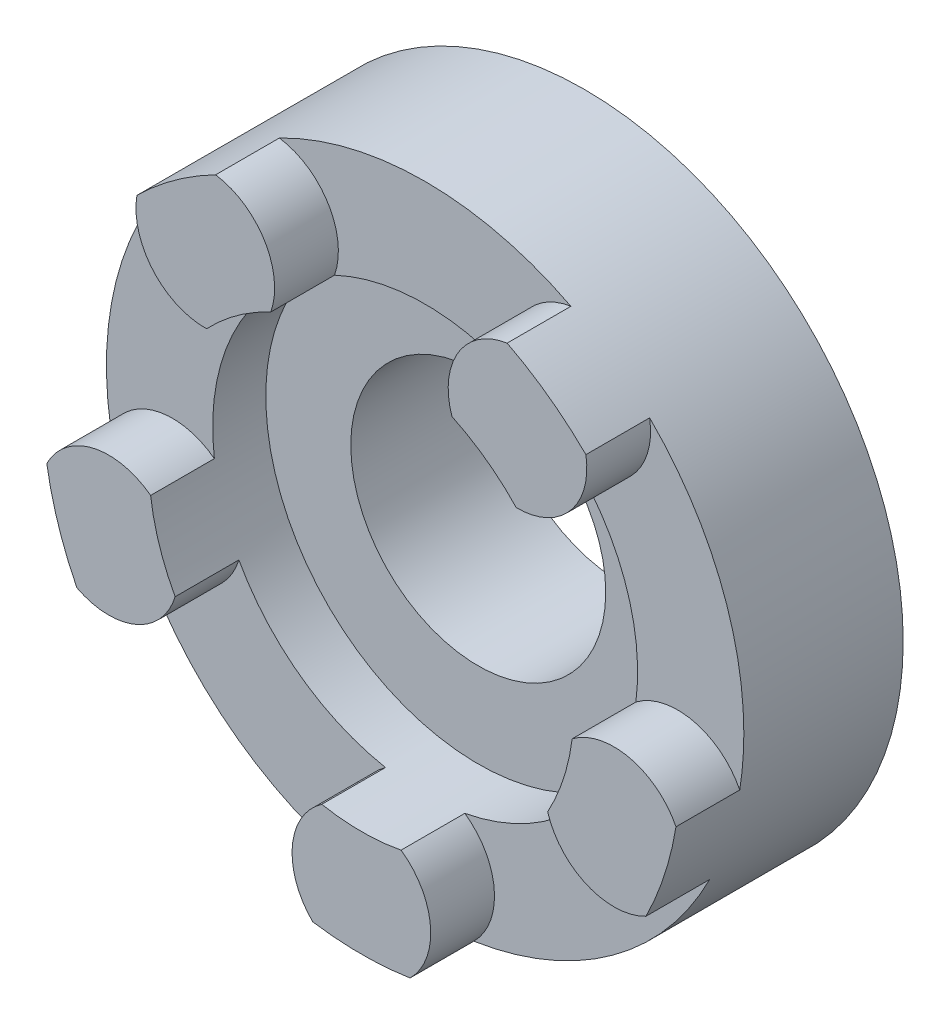
ISO-10303-21;
HEADER;
FILE_DESCRIPTION(('STEP AP214'),'2;1');
FILE_NAME('part.step','',(''),(''),'','','');
FILE_SCHEMA(('AUTOMOTIVE_DESIGN { 1 0 10303 214 1 1 1 1 }'));
ENDSEC;
DATA;
#1=APPLICATION_CONTEXT('core data for automotive mechanical design processes');
#2=APPLICATION_PROTOCOL_DEFINITION('international standard','automotive_design',2000,#1);
#3=PRODUCT_CONTEXT('',#1,'mechanical');
#4=PRODUCT('Part','Part','',(#3));
#5=PRODUCT_RELATED_PRODUCT_CATEGORY('part','',(#4));
#6=PRODUCT_DEFINITION_FORMATION('','',#4);
#7=PRODUCT_DEFINITION_CONTEXT('part definition',#1,'design');
#8=PRODUCT_DEFINITION('design','',#6,#7);
#9=PRODUCT_DEFINITION_SHAPE('','',#8);
#10=(LENGTH_UNIT() NAMED_UNIT(*) SI_UNIT(.MILLI.,.METRE.));
#11=(NAMED_UNIT(*) PLANE_ANGLE_UNIT() SI_UNIT($,.RADIAN.));
#12=(NAMED_UNIT(*) SI_UNIT($,.STERADIAN.) SOLID_ANGLE_UNIT());
#13=UNCERTAINTY_MEASURE_WITH_UNIT(LENGTH_MEASURE(1.E-05),#10,'distance_accuracy_value','');
#14=(GEOMETRIC_REPRESENTATION_CONTEXT(3) GLOBAL_UNCERTAINTY_ASSIGNED_CONTEXT((#13)) GLOBAL_UNIT_ASSIGNED_CONTEXT((#10,
#11,#12)) REPRESENTATION_CONTEXT('',''));
#15=CARTESIAN_POINT('',(0.,0.,0.));
#16=DIRECTION('',(0.,0.,1.));
#17=DIRECTION('',(1.,0.,0.));
#18=AXIS2_PLACEMENT_3D('',#15,#16,#17);
#19=CARTESIAN_POINT('',(0.,0.,-5.));
#20=DIRECTION('',(0.,0.,1.));
#21=DIRECTION('',(1.,0.,0.));
#22=AXIS2_PLACEMENT_3D('',#19,#20,#21);
#23=PLANE('',#22);
#24=CARTESIAN_POINT('',(0.,0.,-5.));
#25=DIRECTION('',(0.,0.,1.));
#26=DIRECTION('',(1.,0.,0.));
#27=AXIS2_PLACEMENT_3D('',#24,#25,#26);
#28=CIRCLE('',#27,15.);
#29=CARTESIAN_POINT('',(15.,0.,-5.));
#30=VERTEX_POINT('',#29);
#31=EDGE_CURVE('E50',#30,#30,#28,.T.);
#32=ORIENTED_EDGE('',*,*,#31,.F.);
#33=EDGE_LOOP('',(#32));
#34=FACE_BOUND('',#33,.T.);
#35=CARTESIAN_POINT('',(0.,0.,-5.));
#36=DIRECTION('',(0.,0.,1.));
#37=DIRECTION('',(1.,0.,0.));
#38=AXIS2_PLACEMENT_3D('',#35,#36,#37);
#39=CIRCLE('',#38,7.);
#40=CARTESIAN_POINT('',(7.,0.,-5.));
#41=VERTEX_POINT('',#40);
#42=EDGE_CURVE('E11',#41,#41,#39,.F.);
#43=ORIENTED_EDGE('',*,*,#42,.F.);
#44=EDGE_LOOP('',(#43));
#45=FACE_BOUND('',#44,.T.);
#46=ADVANCED_FACE('F41',(#34,#45),#23,.F.);
#47=CARTESIAN_POINT('',(0.,0.,2.5));
#48=DIRECTION('',(0.,0.,1.));
#49=DIRECTION('',(1.,0.,0.));
#50=AXIS2_PLACEMENT_3D('',#47,#48,#49);
#51=PLANE('',#50);
#52=CARTESIAN_POINT('',(0.,0.,2.5));
#53=DIRECTION('',(0.,0.,1.));
#54=DIRECTION('',(1.,0.,0.));
#55=AXIS2_PLACEMENT_3D('',#52,#53,#54);
#56=CIRCLE('',#55,15.);
#57=CARTESIAN_POINT('',(2.29060358245761,-14.8240728286133,2.5));
#58=VERTEX_POINT('',#57);
#59=CARTESIAN_POINT('',(13.3906956273311,-6.7593838932388,2.5));
#60=VERTEX_POINT('',#59);
#61=EDGE_CURVE('E372',#58,#60,#56,.T.);
#62=ORIENTED_EDGE('',*,*,#61,.T.);
#63=CARTESIAN_POINT('',(11.8882064536894,-3.86271242968698,2.5));
#64=DIRECTION('',(0.,0.,1.));
#65=DIRECTION('',(1.,0.,0.));
#66=AXIS2_PLACEMENT_3D('',#63,#64,#65);
#67=CIRCLE('',#66,3.26315480550128);
#68=CARTESIAN_POINT('',(8.76615619788801,-4.81191287475464,2.5));
#69=VERTEX_POINT('',#68);
#70=EDGE_CURVE('E195',#69,#60,#67,.T.);
#71=ORIENTED_EDGE('',*,*,#70,.F.);
#72=CARTESIAN_POINT('',(0.,0.,2.5));
#73=DIRECTION('',(0.,0.,1.));
#74=DIRECTION('',(1.,0.,0.));
#75=AXIS2_PLACEMENT_3D('',#72,#73,#74);
#76=CIRCLE('',#75,10.);
#77=CARTESIAN_POINT('',(1.86750985488725,-9.82407282861336,2.5));
#78=VERTEX_POINT('',#77);
#79=EDGE_CURVE('E362',#78,#69,#76,.T.);
#80=ORIENTED_EDGE('',*,*,#79,.F.);
#81=CARTESIAN_POINT('',(0.,-12.5,2.5));
#82=DIRECTION('',(0.,0.,1.));
#83=DIRECTION('',(1.,0.,0.));
#84=AXIS2_PLACEMENT_3D('',#81,#82,#83);
#85=CIRCLE('',#84,3.26315480550132);
#86=EDGE_CURVE('E330',#58,#78,#85,.T.);
#87=ORIENTED_EDGE('',*,*,#86,.F.);
#88=EDGE_LOOP('',(#62,#71,#80,#87));
#89=FACE_BOUND('',#88,.T.);
#90=ADVANCED_FACE('F407',(#89),#51,.T.);
#91=CARTESIAN_POINT('',(9.92034076253372,-1.25969804128286,2.5));
#92=VERTEX_POINT('',#91);
#93=CARTESIAN_POINT('',(7.28529233587261,6.85014712111175,2.5));
#94=VERTEX_POINT('',#93);
#95=EDGE_CURVE('E367',#92,#94,#76,.T.);
#96=ORIENTED_EDGE('',*,*,#95,.F.);
#97=CARTESIAN_POINT('',(11.8882064536894,-3.86271242968698,2.5));
#98=DIRECTION('',(0.,0.,1.));
#99=DIRECTION('',(1.,0.,0.));
#100=AXIS2_PLACEMENT_3D('',#97,#98,#99);
#101=CIRCLE('',#100,3.26315480550132);
#102=CARTESIAN_POINT('',(14.8063664960422,-2.40239696654825,2.5));
#103=VERTEX_POINT('',#102);
#104=EDGE_CURVE('E189',#103,#92,#101,.T.);
#105=ORIENTED_EDGE('',*,*,#104,.F.);
#106=CARTESIAN_POINT('',(10.5665086131529,10.6465438395832,2.5));
#107=VERTEX_POINT('',#106);
#108=EDGE_CURVE('E376',#103,#107,#56,.T.);
#109=ORIENTED_EDGE('',*,*,#108,.T.);
#110=CARTESIAN_POINT('',(7.347315653656,10.1127124296868,2.5));
#111=DIRECTION('',(0.,0.,1.));
#112=DIRECTION('',(1.,0.,0.));
#113=AXIS2_PLACEMENT_3D('',#110,#111,#112);
#114=CIRCLE('',#113,3.26315480550129);
#115=EDGE_CURVE('E200',#94,#107,#114,.T.);
#116=ORIENTED_EDGE('',*,*,#115,.F.);
#117=EDGE_LOOP('',(#96,#105,#109,#116));
#118=FACE_BOUND('',#117,.T.);
#119=ADVANCED_FACE('F415',(#118),#51,.T.);
#120=CARTESIAN_POINT('',(4.26359791633974,9.0455366235389,2.5));
#121=VERTEX_POINT('',#120);
#122=CARTESIAN_POINT('',(-4.26359791633966,9.04553662353894,2.5));
#123=VERTEX_POINT('',#122);
#124=EDGE_CURVE('E524',#121,#123,#76,.T.);
#125=ORIENTED_EDGE('',*,*,#124,.F.);
#126=CARTESIAN_POINT('',(7.347315653656,10.1127124296868,2.5));
#127=DIRECTION('',(0.,0.,1.));
#128=DIRECTION('',(1.,0.,0.));
#129=AXIS2_PLACEMENT_3D('',#126,#127,#128);
#130=CIRCLE('',#129,3.26315480550131);
#131=CARTESIAN_POINT('',(6.86023416198428,13.3393098488169,2.5));
#132=VERTEX_POINT('',#131);
#133=EDGE_CURVE('E230',#132,#121,#130,.T.);
#134=ORIENTED_EDGE('',*,*,#133,.F.);
#135=CARTESIAN_POINT('',(-6.86023416198416,13.339309848817,2.5));
#136=VERTEX_POINT('',#135);
#137=EDGE_CURVE('E502',#132,#136,#56,.T.);
#138=ORIENTED_EDGE('',*,*,#137,.T.);
#139=CARTESIAN_POINT('',(-7.34731565365586,10.1127124296869,2.5));
#140=DIRECTION('',(0.,0.,1.));
#141=DIRECTION('',(1.,0.,0.));
#142=AXIS2_PLACEMENT_3D('',#139,#140,#141);
#143=CIRCLE('',#142,3.26315480550129);
#144=EDGE_CURVE('E257',#123,#136,#143,.T.);
#145=ORIENTED_EDGE('',*,*,#144,.F.);
#146=EDGE_LOOP('',(#125,#134,#138,#145));
#147=FACE_BOUND('',#146,.T.);
#148=ADVANCED_FACE('F547',(#147),#51,.T.);
#149=CARTESIAN_POINT('',(-7.28529233587255,6.85014712111183,2.5));
#150=VERTEX_POINT('',#149);
#151=CARTESIAN_POINT('',(-9.92034076253373,-1.25969804128281,2.5));
#152=VERTEX_POINT('',#151);
#153=EDGE_CURVE('E526',#150,#152,#76,.T.);
#154=ORIENTED_EDGE('',*,*,#153,.F.);
#155=CARTESIAN_POINT('',(-7.34731565365586,10.1127124296869,2.5));
#156=DIRECTION('',(0.,0.,1.));
#157=DIRECTION('',(1.,0.,0.));
#158=AXIS2_PLACEMENT_3D('',#155,#156,#157);
#159=CIRCLE('',#158,3.26315480550131);
#160=CARTESIAN_POINT('',(-10.5665086131528,10.6465438395833,2.5));
#161=VERTEX_POINT('',#160);
#162=EDGE_CURVE('E262',#161,#150,#159,.T.);
#163=ORIENTED_EDGE('',*,*,#162,.F.);
#164=CARTESIAN_POINT('',(-14.8063664960422,-2.40239696654818,2.5));
#165=VERTEX_POINT('',#164);
#166=EDGE_CURVE('E500',#161,#165,#56,.T.);
#167=ORIENTED_EDGE('',*,*,#166,.T.);
#168=CARTESIAN_POINT('',(-11.8882064536894,-3.86271242968685,2.5));
#169=DIRECTION('',(0.,0.,1.));
#170=DIRECTION('',(1.,0.,0.));
#171=AXIS2_PLACEMENT_3D('',#168,#169,#170);
#172=CIRCLE('',#171,3.26315480550128);
#173=EDGE_CURVE('E291',#152,#165,#172,.T.);
#174=ORIENTED_EDGE('',*,*,#173,.F.);
#175=EDGE_LOOP('',(#154,#163,#167,#174));
#176=FACE_BOUND('',#175,.T.);
#177=ADVANCED_FACE('F539',(#176),#51,.T.);
#178=CARTESIAN_POINT('',(-8.76615619788804,-4.81191287475461,2.5));
#179=VERTEX_POINT('',#178);
#180=CARTESIAN_POINT('',(-1.86750985488717,-9.82407282861336,2.5));
#181=VERTEX_POINT('',#180);
#182=EDGE_CURVE('E368',#179,#181,#76,.T.);
#183=ORIENTED_EDGE('',*,*,#182,.F.);
#184=CARTESIAN_POINT('',(-11.8882064536894,-3.86271242968685,2.5));
#185=DIRECTION('',(0.,0.,1.));
#186=DIRECTION('',(1.,0.,0.));
#187=AXIS2_PLACEMENT_3D('',#184,#185,#186);
#188=CIRCLE('',#187,3.26315480550132);
#189=CARTESIAN_POINT('',(-13.3906956273311,-6.75938389323874,2.5));
#190=VERTEX_POINT('',#189);
#191=EDGE_CURVE('E296',#190,#179,#188,.T.);
#192=ORIENTED_EDGE('',*,*,#191,.F.);
#193=CARTESIAN_POINT('',(-2.29060358245752,-14.8240728286134,2.5));
#194=VERTEX_POINT('',#193);
#195=EDGE_CURVE('E366',#190,#194,#56,.T.);
#196=ORIENTED_EDGE('',*,*,#195,.T.);
#197=CARTESIAN_POINT('',(0.,-12.5,2.5));
#198=DIRECTION('',(0.,0.,1.));
#199=DIRECTION('',(1.,0.,0.));
#200=AXIS2_PLACEMENT_3D('',#197,#198,#199);
#201=CIRCLE('',#200,3.26315480550128);
#202=EDGE_CURVE('E325',#181,#194,#201,.T.);
#203=ORIENTED_EDGE('',*,*,#202,.F.);
#204=EDGE_LOOP('',(#183,#192,#196,#203));
#205=FACE_BOUND('',#204,.T.);
#206=ADVANCED_FACE('F389',(#205),#51,.T.);
#207=CARTESIAN_POINT('',(0.,0.,0.));
#208=DIRECTION('',(0.,0.,1.));
#209=DIRECTION('',(1.,0.,0.));
#210=AXIS2_PLACEMENT_3D('',#207,#208,#209);
#211=PLANE('',#210);
#212=CARTESIAN_POINT('',(0.,0.,0.));
#213=DIRECTION('',(0.,0.,1.));
#214=DIRECTION('',(1.,0.,0.));
#215=AXIS2_PLACEMENT_3D('',#212,#213,#214);
#216=CIRCLE('',#215,6.);
#217=CARTESIAN_POINT('',(6.,0.,0.));
#218=VERTEX_POINT('',#217);
#219=EDGE_CURVE('E375',#218,#218,#216,.T.);
#220=ORIENTED_EDGE('',*,*,#219,.F.);
#221=EDGE_LOOP('',(#220));
#222=FACE_BOUND('',#221,.T.);
#223=CARTESIAN_POINT('',(0.,0.,0.));
#224=DIRECTION('',(0.,0.,1.));
#225=DIRECTION('',(1.,0.,0.));
#226=AXIS2_PLACEMENT_3D('',#223,#224,#225);
#227=CIRCLE('',#226,10.);
#228=CARTESIAN_POINT('',(10.,0.,0.));
#229=VERTEX_POINT('',#228);
#230=EDGE_CURVE('E361',#229,#229,#227,.T.);
#231=ORIENTED_EDGE('',*,*,#230,.T.);
#232=EDGE_LOOP('',(#231));
#233=FACE_BOUND('',#232,.T.);
#234=ADVANCED_FACE('F386',(#222,#233),#211,.T.);
#235=CARTESIAN_POINT('',(0.,0.,-5.));
#236=DIRECTION('',(0.,0.,1.));
#237=DIRECTION('',(1.,0.,0.));
#238=AXIS2_PLACEMENT_3D('',#235,#236,#237);
#239=CYLINDRICAL_SURFACE('',#238,15.);
#240=ORIENTED_EDGE('',*,*,#31,.T.);
#241=EDGE_LOOP('',(#240));
#242=FACE_BOUND('',#241,.T.);
#243=ORIENTED_EDGE('',*,*,#61,.F.);
#244=DIRECTION('',(0.,0.,-1.));
#245=VECTOR('',#244,1.);
#246=CARTESIAN_POINT('',(2.29060358245762,-14.8240728286133,5.5));
#247=LINE('',#246,#245);
#248=CARTESIAN_POINT('',(2.29060358245762,-14.8240728286133,5.5));
#249=VERTEX_POINT('',#248);
#250=EDGE_CURVE('E353',#249,#58,#247,.T.);
#251=ORIENTED_EDGE('',*,*,#250,.F.);
#252=CARTESIAN_POINT('',(0.,0.,5.5));
#253=DIRECTION('',(0.,0.,1.));
#254=DIRECTION('',(1.,0.,0.));
#255=AXIS2_PLACEMENT_3D('',#252,#253,#254);
#256=CIRCLE('',#255,15.);
#257=CARTESIAN_POINT('',(-2.29060358245749,-14.8240728286134,5.5));
#258=VERTEX_POINT('',#257);
#259=EDGE_CURVE('E329',#258,#249,#256,.T.);
#260=ORIENTED_EDGE('',*,*,#259,.F.);
#261=DIRECTION('',(0.,0.,-1.));
#262=VECTOR('',#261,1.);
#263=CARTESIAN_POINT('',(-2.29060358245749,-14.8240728286134,5.5));
#264=LINE('',#263,#262);
#265=EDGE_CURVE('E357',#258,#194,#264,.T.);
#266=ORIENTED_EDGE('',*,*,#265,.T.);
#267=ORIENTED_EDGE('',*,*,#195,.F.);
#268=DIRECTION('',(0.,0.,-1.));
#269=VECTOR('',#268,1.);
#270=CARTESIAN_POINT('',(-13.3906956273311,-6.75938389323874,5.5));
#271=LINE('',#270,#269);
#272=CARTESIAN_POINT('',(-13.3906956273311,-6.75938389323874,5.5));
#273=VERTEX_POINT('',#272);
#274=EDGE_CURVE('E318',#273,#190,#271,.T.);
#275=ORIENTED_EDGE('',*,*,#274,.F.);
#276=CARTESIAN_POINT('',(0.,0.,5.5));
#277=DIRECTION('',(0.,0.,1.));
#278=DIRECTION('',(1.,0.,0.));
#279=AXIS2_PLACEMENT_3D('',#276,#277,#278);
#280=CIRCLE('',#279,15.);
#281=CARTESIAN_POINT('',(-14.8063664960422,-2.40239696654818,5.5));
#282=VERTEX_POINT('',#281);
#283=EDGE_CURVE('E295',#282,#273,#280,.T.);
#284=ORIENTED_EDGE('',*,*,#283,.F.);
#285=DIRECTION('',(0.,0.,-1.));
#286=VECTOR('',#285,1.);
#287=CARTESIAN_POINT('',(-14.8063664960422,-2.40239696654818,5.5));
#288=LINE('',#287,#286);
#289=EDGE_CURVE('E321',#282,#165,#288,.T.);
#290=ORIENTED_EDGE('',*,*,#289,.T.);
#291=ORIENTED_EDGE('',*,*,#166,.F.);
#292=DIRECTION('',(0.,0.,-1.));
#293=VECTOR('',#292,1.);
#294=CARTESIAN_POINT('',(-10.5665086131528,10.6465438395833,5.5));
#295=LINE('',#294,#293);
#296=CARTESIAN_POINT('',(-10.5665086131528,10.6465438395833,5.5));
#297=VERTEX_POINT('',#296);
#298=EDGE_CURVE('E284',#297,#161,#295,.T.);
#299=ORIENTED_EDGE('',*,*,#298,.F.);
#300=CARTESIAN_POINT('',(0.,0.,5.5));
#301=DIRECTION('',(0.,0.,1.));
#302=DIRECTION('',(1.,0.,0.));
#303=AXIS2_PLACEMENT_3D('',#300,#301,#302);
#304=CIRCLE('',#303,15.);
#305=CARTESIAN_POINT('',(-6.86023416198416,13.339309848817,5.5));
#306=VERTEX_POINT('',#305);
#307=EDGE_CURVE('E261',#306,#297,#304,.T.);
#308=ORIENTED_EDGE('',*,*,#307,.F.);
#309=DIRECTION('',(0.,0.,-1.));
#310=VECTOR('',#309,1.);
#311=CARTESIAN_POINT('',(-6.86023416198416,13.339309848817,5.5));
#312=LINE('',#311,#310);
#313=EDGE_CURVE('E287',#306,#136,#312,.T.);
#314=ORIENTED_EDGE('',*,*,#313,.T.);
#315=ORIENTED_EDGE('',*,*,#137,.F.);
#316=DIRECTION('',(0.,0.,-1.));
#317=VECTOR('',#316,1.);
#318=CARTESIAN_POINT('',(6.86023416198428,13.3393098488169,5.5));
#319=LINE('',#318,#317);
#320=CARTESIAN_POINT('',(6.86023416198428,13.3393098488169,5.5));
#321=VERTEX_POINT('',#320);
#322=EDGE_CURVE('E250',#321,#132,#319,.T.);
#323=ORIENTED_EDGE('',*,*,#322,.F.);
#324=CARTESIAN_POINT('',(0.,0.,5.5));
#325=DIRECTION('',(0.,0.,1.));
#326=DIRECTION('',(1.,0.,0.));
#327=AXIS2_PLACEMENT_3D('',#324,#325,#326);
#328=CIRCLE('',#327,15.);
#329=CARTESIAN_POINT('',(10.5665086131529,10.6465438395832,5.5));
#330=VERTEX_POINT('',#329);
#331=EDGE_CURVE('E229',#330,#321,#328,.T.);
#332=ORIENTED_EDGE('',*,*,#331,.F.);
#333=DIRECTION('',(0.,0.,-1.));
#334=VECTOR('',#333,1.);
#335=CARTESIAN_POINT('',(10.5665086131529,10.6465438395832,5.5));
#336=LINE('',#335,#334);
#337=EDGE_CURVE('E253',#330,#107,#336,.T.);
#338=ORIENTED_EDGE('',*,*,#337,.T.);
#339=ORIENTED_EDGE('',*,*,#108,.F.);
#340=DIRECTION('',(0.,0.,-1.));
#341=VECTOR('',#340,1.);
#342=CARTESIAN_POINT('',(14.8063664960422,-2.40239696654825,5.5));
#343=LINE('',#342,#341);
#344=CARTESIAN_POINT('',(14.8063664960422,-2.40239696654825,5.5));
#345=VERTEX_POINT('',#344);
#346=EDGE_CURVE('E201',#345,#103,#343,.T.);
#347=ORIENTED_EDGE('',*,*,#346,.F.);
#348=CARTESIAN_POINT('',(0.,0.,5.5));
#349=DIRECTION('',(0.,0.,1.));
#350=DIRECTION('',(1.,0.,0.));
#351=AXIS2_PLACEMENT_3D('',#348,#349,#350);
#352=CIRCLE('',#351,15.);
#353=CARTESIAN_POINT('',(13.3906956273311,-6.7593838932388,5.5));
#354=VERTEX_POINT('',#353);
#355=EDGE_CURVE('E183',#354,#345,#352,.T.);
#356=ORIENTED_EDGE('',*,*,#355,.F.);
#357=DIRECTION('',(0.,0.,-1.));
#358=VECTOR('',#357,1.);
#359=CARTESIAN_POINT('',(13.3906956273311,-6.7593838932388,5.5));
#360=LINE('',#359,#358);
#361=EDGE_CURVE('E192',#354,#60,#360,.T.);
#362=ORIENTED_EDGE('',*,*,#361,.T.);
#363=EDGE_LOOP('',(#243,#251,#260,#266,#267,#275,#284,#290,#291,#299,#308,#314,#315,#323,#332,
#338,#339,#347,#356,#362));
#364=FACE_BOUND('',#363,.T.);
#365=ADVANCED_FACE('F43',(#242,#364),#239,.T.);
#366=CARTESIAN_POINT('',(0.,0.,-5.));
#367=DIRECTION('',(0.,0.,1.));
#368=DIRECTION('',(1.,0.,0.));
#369=AXIS2_PLACEMENT_3D('',#366,#367,#368);
#370=CYLINDRICAL_SURFACE('',#369,6.);
#371=ORIENTED_EDGE('',*,*,#219,.T.);
#372=EDGE_LOOP('',(#371));
#373=FACE_BOUND('',#372,.T.);
#374=CARTESIAN_POINT('',(0.,0.,-6.75));
#375=DIRECTION('',(0.,0.,-1.));
#376=DIRECTION('',(-1.,0.,0.));
#377=AXIS2_PLACEMENT_3D('',#374,#375,#376);
#378=CIRCLE('',#377,6.);
#379=CARTESIAN_POINT('',(-6.,0.,-6.75));
#380=VERTEX_POINT('',#379);
#381=EDGE_CURVE('E779',#380,#380,#378,.T.);
#382=ORIENTED_EDGE('',*,*,#381,.T.);
#383=EDGE_LOOP('',(#382));
#384=FACE_BOUND('',#383,.T.);
#385=ADVANCED_FACE('F383',(#373,#384),#370,.F.);
#386=CARTESIAN_POINT('',(0.,0.,2.5));
#387=DIRECTION('',(0.,0.,-1.));
#388=DIRECTION('',(-1.,0.,0.));
#389=AXIS2_PLACEMENT_3D('',#386,#387,#388);
#390=CYLINDRICAL_SURFACE('',#389,10.);
#391=ORIENTED_EDGE('',*,*,#79,.T.);
#392=DIRECTION('',(0.,0.,-1.));
#393=VECTOR('',#392,1.);
#394=CARTESIAN_POINT('',(8.76615619788801,-4.81191287475464,5.5));
#395=LINE('',#394,#393);
#396=CARTESIAN_POINT('',(8.76615619788801,-4.81191287475464,5.5));
#397=VERTEX_POINT('',#396);
#398=EDGE_CURVE('E214',#397,#69,#395,.T.);
#399=ORIENTED_EDGE('',*,*,#398,.F.);
#400=CARTESIAN_POINT('',(0.,0.,5.5));
#401=DIRECTION('',(0.,0.,-1.));
#402=DIRECTION('',(1.,0.,0.));
#403=AXIS2_PLACEMENT_3D('',#400,#401,#402);
#404=CIRCLE('',#403,9.99999999999999);
#405=CARTESIAN_POINT('',(9.92034076253373,-1.25969804128286,5.5));
#406=VERTEX_POINT('',#405);
#407=EDGE_CURVE('E185',#406,#397,#404,.T.);
#408=ORIENTED_EDGE('',*,*,#407,.F.);
#409=DIRECTION('',(0.,0.,-1.));
#410=VECTOR('',#409,1.);
#411=CARTESIAN_POINT('',(9.92034076253373,-1.25969804128286,5.5));
#412=LINE('',#411,#410);
#413=EDGE_CURVE('E57',#406,#92,#412,.T.);
#414=ORIENTED_EDGE('',*,*,#413,.T.);
#415=ORIENTED_EDGE('',*,*,#95,.T.);
#416=DIRECTION('',(0.,0.,-1.));
#417=VECTOR('',#416,1.);
#418=CARTESIAN_POINT('',(7.28529233587261,6.85014712111175,5.5));
#419=LINE('',#418,#417);
#420=CARTESIAN_POINT('',(7.28529233587261,6.85014712111175,5.5));
#421=VERTEX_POINT('',#420);
#422=EDGE_CURVE('E239',#421,#94,#419,.T.);
#423=ORIENTED_EDGE('',*,*,#422,.F.);
#424=CARTESIAN_POINT('',(0.,0.,5.5));
#425=DIRECTION('',(0.,0.,-1.));
#426=DIRECTION('',(1.,0.,0.));
#427=AXIS2_PLACEMENT_3D('',#424,#425,#426);
#428=CIRCLE('',#427,9.99999999999999);
#429=CARTESIAN_POINT('',(4.26359791633974,9.0455366235389,5.5));
#430=VERTEX_POINT('',#429);
#431=EDGE_CURVE('E236',#430,#421,#428,.T.);
#432=ORIENTED_EDGE('',*,*,#431,.F.);
#433=DIRECTION('',(0.,0.,-1.));
#434=VECTOR('',#433,1.);
#435=CARTESIAN_POINT('',(4.26359791633974,9.0455366235389,5.5));
#436=LINE('',#435,#434);
#437=EDGE_CURVE('E64',#430,#121,#436,.T.);
#438=ORIENTED_EDGE('',*,*,#437,.T.);
#439=ORIENTED_EDGE('',*,*,#124,.T.);
#440=DIRECTION('',(0.,0.,-1.));
#441=VECTOR('',#440,1.);
#442=CARTESIAN_POINT('',(-4.26359791633966,9.04553662353894,5.5));
#443=LINE('',#442,#441);
#444=CARTESIAN_POINT('',(-4.26359791633966,9.04553662353894,5.5));
#445=VERTEX_POINT('',#444);
#446=EDGE_CURVE('E271',#445,#123,#443,.T.);
#447=ORIENTED_EDGE('',*,*,#446,.F.);
#448=CARTESIAN_POINT('',(0.,0.,5.5));
#449=DIRECTION('',(0.,0.,-1.));
#450=DIRECTION('',(1.,0.,0.));
#451=AXIS2_PLACEMENT_3D('',#448,#449,#450);
#452=CIRCLE('',#451,10.);
#453=CARTESIAN_POINT('',(-7.28529233587256,6.85014712111183,5.5));
#454=VERTEX_POINT('',#453);
#455=EDGE_CURVE('E268',#454,#445,#452,.T.);
#456=ORIENTED_EDGE('',*,*,#455,.F.);
#457=DIRECTION('',(0.,0.,-1.));
#458=VECTOR('',#457,1.);
#459=CARTESIAN_POINT('',(-7.28529233587256,6.85014712111183,5.5));
#460=LINE('',#459,#458);
#461=EDGE_CURVE('E281',#454,#150,#460,.T.);
#462=ORIENTED_EDGE('',*,*,#461,.T.);
#463=ORIENTED_EDGE('',*,*,#153,.T.);
#464=DIRECTION('',(0.,0.,-1.));
#465=VECTOR('',#464,1.);
#466=CARTESIAN_POINT('',(-9.92034076253373,-1.25969804128281,5.5));
#467=LINE('',#466,#465);
#468=CARTESIAN_POINT('',(-9.92034076253373,-1.25969804128281,5.5));
#469=VERTEX_POINT('',#468);
#470=EDGE_CURVE('E305',#469,#152,#467,.T.);
#471=ORIENTED_EDGE('',*,*,#470,.F.);
#472=CARTESIAN_POINT('',(0.,0.,5.5));
#473=DIRECTION('',(0.,0.,-1.));
#474=DIRECTION('',(1.,0.,0.));
#475=AXIS2_PLACEMENT_3D('',#472,#473,#474);
#476=CIRCLE('',#475,10.);
#477=CARTESIAN_POINT('',(-8.76615619788804,-4.81191287475461,5.5));
#478=VERTEX_POINT('',#477);
#479=EDGE_CURVE('E302',#478,#469,#476,.T.);
#480=ORIENTED_EDGE('',*,*,#479,.F.);
#481=DIRECTION('',(0.,0.,-1.));
#482=VECTOR('',#481,1.);
#483=CARTESIAN_POINT('',(-8.76615619788804,-4.81191287475461,5.5));
#484=LINE('',#483,#482);
#485=EDGE_CURVE('E315',#478,#179,#484,.T.);
#486=ORIENTED_EDGE('',*,*,#485,.T.);
#487=ORIENTED_EDGE('',*,*,#182,.T.);
#488=DIRECTION('',(0.,0.,-1.));
#489=VECTOR('',#488,1.);
#490=CARTESIAN_POINT('',(-1.86750985488717,-9.82407282861337,5.5));
#491=LINE('',#490,#489);
#492=CARTESIAN_POINT('',(-1.86750985488717,-9.82407282861337,5.5));
#493=VERTEX_POINT('',#492);
#494=EDGE_CURVE('E339',#493,#181,#491,.T.);
#495=ORIENTED_EDGE('',*,*,#494,.F.);
#496=CARTESIAN_POINT('',(0.,0.,5.5));
#497=DIRECTION('',(0.,0.,-1.));
#498=DIRECTION('',(1.,0.,0.));
#499=AXIS2_PLACEMENT_3D('',#496,#497,#498);
#500=CIRCLE('',#499,10.);
#501=CARTESIAN_POINT('',(1.86750985488725,-9.82407282861336,5.5));
#502=VERTEX_POINT('',#501);
#503=EDGE_CURVE('E336',#502,#493,#500,.T.);
#504=ORIENTED_EDGE('',*,*,#503,.F.);
#505=DIRECTION('',(0.,0.,-1.));
#506=VECTOR('',#505,1.);
#507=CARTESIAN_POINT('',(1.86750985488725,-9.82407282861336,5.5));
#508=LINE('',#507,#506);
#509=EDGE_CURVE('E349',#502,#78,#508,.T.);
#510=ORIENTED_EDGE('',*,*,#509,.T.);
#511=EDGE_LOOP('',(#391,#399,#408,#414,#415,#423,#432,#438,#439,#447,#456,#462,#463,#471,#480,
#486,#487,#495,#504,#510));
#512=FACE_BOUND('',#511,.T.);
#513=ORIENTED_EDGE('',*,*,#230,.F.);
#514=EDGE_LOOP('',(#513));
#515=FACE_BOUND('',#514,.T.);
#516=ADVANCED_FACE('F393',(#512,#515),#390,.F.);
#517=CARTESIAN_POINT('',(0.,-12.5,5.5));
#518=DIRECTION('',(0.,0.,-1.));
#519=DIRECTION('',(-1.,0.,0.));
#520=AXIS2_PLACEMENT_3D('',#517,#518,#519);
#521=CYLINDRICAL_SURFACE('',#520,3.26315480550128);
#522=ORIENTED_EDGE('',*,*,#202,.T.);
#523=ORIENTED_EDGE('',*,*,#265,.F.);
#524=CARTESIAN_POINT('',(0.,-12.5,5.5));
#525=DIRECTION('',(0.,0.,1.));
#526=DIRECTION('',(-1.,0.,0.));
#527=AXIS2_PLACEMENT_3D('',#524,#525,#526);
#528=CIRCLE('',#527,3.26315480550128);
#529=EDGE_CURVE('E326',#493,#258,#528,.T.);
#530=ORIENTED_EDGE('',*,*,#529,.F.);
#531=ORIENTED_EDGE('',*,*,#494,.T.);
#532=EDGE_LOOP('',(#522,#523,#530,#531));
#533=FACE_BOUND('',#532,.T.);
#534=ADVANCED_FACE('F395',(#533),#521,.T.);
#535=CARTESIAN_POINT('',(0.,-12.5,5.5));
#536=DIRECTION('',(0.,0.,-1.));
#537=DIRECTION('',(-1.,0.,0.));
#538=AXIS2_PLACEMENT_3D('',#535,#536,#537);
#539=CYLINDRICAL_SURFACE('',#538,3.26315480550132);
#540=ORIENTED_EDGE('',*,*,#86,.T.);
#541=ORIENTED_EDGE('',*,*,#509,.F.);
#542=CARTESIAN_POINT('',(0.,-12.5,5.5));
#543=DIRECTION('',(0.,0.,1.));
#544=DIRECTION('',(-1.,0.,0.));
#545=AXIS2_PLACEMENT_3D('',#542,#543,#544);
#546=CIRCLE('',#545,3.26315480550132);
#547=EDGE_CURVE('E333',#249,#502,#546,.T.);
#548=ORIENTED_EDGE('',*,*,#547,.F.);
#549=ORIENTED_EDGE('',*,*,#250,.T.);
#550=EDGE_LOOP('',(#540,#541,#548,#549));
#551=FACE_BOUND('',#550,.T.);
#552=ADVANCED_FACE('F401',(#551),#539,.T.);
#553=CARTESIAN_POINT('',(0.,-6.25,5.5));
#554=DIRECTION('',(0.,0.,-1.));
#555=DIRECTION('',(-1.,0.,0.));
#556=AXIS2_PLACEMENT_3D('',#553,#554,#555);
#557=PLANE('',#556);
#558=ORIENTED_EDGE('',*,*,#529,.T.);
#559=ORIENTED_EDGE('',*,*,#259,.T.);
#560=ORIENTED_EDGE('',*,*,#547,.T.);
#561=ORIENTED_EDGE('',*,*,#503,.T.);
#562=EDGE_LOOP('',(#558,#559,#560,#561));
#563=FACE_BOUND('',#562,.T.);
#564=ADVANCED_FACE('F476',(#563),#557,.F.);
#565=CARTESIAN_POINT('',(-11.8882064536894,-3.86271242968685,5.5));
#566=DIRECTION('',(0.,0.,-1.));
#567=DIRECTION('',(-1.,0.,0.));
#568=AXIS2_PLACEMENT_3D('',#565,#566,#567);
#569=CYLINDRICAL_SURFACE('',#568,3.26315480550128);
#570=ORIENTED_EDGE('',*,*,#173,.T.);
#571=ORIENTED_EDGE('',*,*,#289,.F.);
#572=CARTESIAN_POINT('',(-11.8882064536894,-3.86271242968685,5.5));
#573=DIRECTION('',(0.,0.,1.));
#574=DIRECTION('',(-1.,0.,0.));
#575=AXIS2_PLACEMENT_3D('',#572,#573,#574);
#576=CIRCLE('',#575,3.26315480550128);
#577=EDGE_CURVE('E292',#469,#282,#576,.T.);
#578=ORIENTED_EDGE('',*,*,#577,.F.);
#579=ORIENTED_EDGE('',*,*,#470,.T.);
#580=EDGE_LOOP('',(#570,#571,#578,#579));
#581=FACE_BOUND('',#580,.T.);
#582=ADVANCED_FACE('F472',(#581),#569,.T.);
#583=CARTESIAN_POINT('',(-11.8882064536894,-3.86271242968685,5.5));
#584=DIRECTION('',(0.,0.,-1.));
#585=DIRECTION('',(-1.,0.,0.));
#586=AXIS2_PLACEMENT_3D('',#583,#584,#585);
#587=CYLINDRICAL_SURFACE('',#586,3.26315480550132);
#588=ORIENTED_EDGE('',*,*,#191,.T.);
#589=ORIENTED_EDGE('',*,*,#485,.F.);
#590=CARTESIAN_POINT('',(-11.8882064536894,-3.86271242968685,5.5));
#591=DIRECTION('',(0.,0.,1.));
#592=DIRECTION('',(-1.,0.,0.));
#593=AXIS2_PLACEMENT_3D('',#590,#591,#592);
#594=CIRCLE('',#593,3.26315480550132);
#595=EDGE_CURVE('E299',#273,#478,#594,.T.);
#596=ORIENTED_EDGE('',*,*,#595,.F.);
#597=ORIENTED_EDGE('',*,*,#274,.T.);
#598=EDGE_LOOP('',(#588,#589,#596,#597));
#599=FACE_BOUND('',#598,.T.);
#600=ADVANCED_FACE('F468',(#599),#587,.T.);
#601=CARTESIAN_POINT('',(-5.94410322684471,-1.93135621484342,5.5));
#602=DIRECTION('',(0.,0.,-1.));
#603=DIRECTION('',(-1.,0.,0.));
#604=AXIS2_PLACEMENT_3D('',#601,#602,#603);
#605=PLANE('',#604);
#606=ORIENTED_EDGE('',*,*,#577,.T.);
#607=ORIENTED_EDGE('',*,*,#283,.T.);
#608=ORIENTED_EDGE('',*,*,#595,.T.);
#609=ORIENTED_EDGE('',*,*,#479,.T.);
#610=EDGE_LOOP('',(#606,#607,#608,#609));
#611=FACE_BOUND('',#610,.T.);
#612=ADVANCED_FACE('F464',(#611),#605,.F.);
#613=CARTESIAN_POINT('',(-7.34731565365586,10.1127124296869,5.5));
#614=DIRECTION('',(0.,0.,-1.));
#615=DIRECTION('',(-1.,0.,0.));
#616=AXIS2_PLACEMENT_3D('',#613,#614,#615);
#617=CYLINDRICAL_SURFACE('',#616,3.26315480550129);
#618=ORIENTED_EDGE('',*,*,#144,.T.);
#619=ORIENTED_EDGE('',*,*,#313,.F.);
#620=CARTESIAN_POINT('',(-7.34731565365586,10.1127124296869,5.5));
#621=DIRECTION('',(0.,0.,1.));
#622=DIRECTION('',(-1.,0.,0.));
#623=AXIS2_PLACEMENT_3D('',#620,#621,#622);
#624=CIRCLE('',#623,3.26315480550129);
#625=EDGE_CURVE('E258',#445,#306,#624,.T.);
#626=ORIENTED_EDGE('',*,*,#625,.F.);
#627=ORIENTED_EDGE('',*,*,#446,.T.);
#628=EDGE_LOOP('',(#618,#619,#626,#627));
#629=FACE_BOUND('',#628,.T.);
#630=ADVANCED_FACE('F460',(#629),#617,.T.);
#631=CARTESIAN_POINT('',(-7.34731565365586,10.1127124296869,5.5));
#632=DIRECTION('',(0.,0.,-1.));
#633=DIRECTION('',(-1.,0.,0.));
#634=AXIS2_PLACEMENT_3D('',#631,#632,#633);
#635=CYLINDRICAL_SURFACE('',#634,3.26315480550131);
#636=ORIENTED_EDGE('',*,*,#162,.T.);
#637=ORIENTED_EDGE('',*,*,#461,.F.);
#638=CARTESIAN_POINT('',(-7.34731565365586,10.1127124296869,5.5));
#639=DIRECTION('',(0.,0.,1.));
#640=DIRECTION('',(-1.,0.,0.));
#641=AXIS2_PLACEMENT_3D('',#638,#639,#640);
#642=CIRCLE('',#641,3.26315480550131);
#643=EDGE_CURVE('E265',#297,#454,#642,.T.);
#644=ORIENTED_EDGE('',*,*,#643,.F.);
#645=ORIENTED_EDGE('',*,*,#298,.T.);
#646=EDGE_LOOP('',(#636,#637,#644,#645));
#647=FACE_BOUND('',#646,.T.);
#648=ADVANCED_FACE('F456',(#647),#635,.T.);
#649=CARTESIAN_POINT('',(-3.67365782682793,5.05635621484344,5.5));
#650=DIRECTION('',(0.,0.,-1.));
#651=DIRECTION('',(-1.,0.,0.));
#652=AXIS2_PLACEMENT_3D('',#649,#650,#651);
#653=PLANE('',#652);
#654=ORIENTED_EDGE('',*,*,#625,.T.);
#655=ORIENTED_EDGE('',*,*,#307,.T.);
#656=ORIENTED_EDGE('',*,*,#643,.T.);
#657=ORIENTED_EDGE('',*,*,#455,.T.);
#658=EDGE_LOOP('',(#654,#655,#656,#657));
#659=FACE_BOUND('',#658,.T.);
#660=ADVANCED_FACE('F452',(#659),#653,.F.);
#661=CARTESIAN_POINT('',(7.347315653656,10.1127124296868,5.5));
#662=DIRECTION('',(0.,0.,-1.));
#663=DIRECTION('',(-1.,0.,0.));
#664=AXIS2_PLACEMENT_3D('',#661,#662,#663);
#665=CYLINDRICAL_SURFACE('',#664,3.26315480550129);
#666=ORIENTED_EDGE('',*,*,#115,.T.);
#667=ORIENTED_EDGE('',*,*,#337,.F.);
#668=CARTESIAN_POINT('',(7.347315653656,10.1127124296868,5.5));
#669=DIRECTION('',(0.,0.,1.));
#670=DIRECTION('',(-1.,0.,0.));
#671=AXIS2_PLACEMENT_3D('',#668,#669,#670);
#672=CIRCLE('',#671,3.26315480550129);
#673=EDGE_CURVE('E226',#421,#330,#672,.T.);
#674=ORIENTED_EDGE('',*,*,#673,.F.);
#675=ORIENTED_EDGE('',*,*,#422,.T.);
#676=EDGE_LOOP('',(#666,#667,#674,#675));
#677=FACE_BOUND('',#676,.T.);
#678=ADVANCED_FACE('F448',(#677),#665,.T.);
#679=CARTESIAN_POINT('',(7.347315653656,10.1127124296868,5.5));
#680=DIRECTION('',(0.,0.,-1.));
#681=DIRECTION('',(-1.,0.,0.));
#682=AXIS2_PLACEMENT_3D('',#679,#680,#681);
#683=CYLINDRICAL_SURFACE('',#682,3.26315480550131);
#684=ORIENTED_EDGE('',*,*,#133,.T.);
#685=ORIENTED_EDGE('',*,*,#437,.F.);
#686=CARTESIAN_POINT('',(7.347315653656,10.1127124296868,5.5));
#687=DIRECTION('',(0.,0.,1.));
#688=DIRECTION('',(-1.,0.,0.));
#689=AXIS2_PLACEMENT_3D('',#686,#687,#688);
#690=CIRCLE('',#689,3.26315480550131);
#691=EDGE_CURVE('E233',#321,#430,#690,.T.);
#692=ORIENTED_EDGE('',*,*,#691,.F.);
#693=ORIENTED_EDGE('',*,*,#322,.T.);
#694=EDGE_LOOP('',(#684,#685,#692,#693));
#695=FACE_BOUND('',#694,.T.);
#696=ADVANCED_FACE('F444',(#695),#683,.T.);
#697=CARTESIAN_POINT('',(3.673657826828,5.05635621484339,5.5));
#698=DIRECTION('',(0.,0.,-1.));
#699=DIRECTION('',(-1.,0.,0.));
#700=AXIS2_PLACEMENT_3D('',#697,#698,#699);
#701=PLANE('',#700);
#702=ORIENTED_EDGE('',*,*,#673,.T.);
#703=ORIENTED_EDGE('',*,*,#331,.T.);
#704=ORIENTED_EDGE('',*,*,#691,.T.);
#705=ORIENTED_EDGE('',*,*,#431,.T.);
#706=EDGE_LOOP('',(#702,#703,#704,#705));
#707=FACE_BOUND('',#706,.T.);
#708=ADVANCED_FACE('F441',(#707),#701,.F.);
#709=CARTESIAN_POINT('',(11.8882064536894,-3.86271242968698,5.5));
#710=DIRECTION('',(0.,0.,-1.));
#711=DIRECTION('',(-1.,0.,0.));
#712=AXIS2_PLACEMENT_3D('',#709,#710,#711);
#713=CYLINDRICAL_SURFACE('',#712,3.26315480550128);
#714=ORIENTED_EDGE('',*,*,#70,.T.);
#715=ORIENTED_EDGE('',*,*,#361,.F.);
#716=CARTESIAN_POINT('',(11.8882064536894,-3.86271242968698,5.5));
#717=DIRECTION('',(0.,0.,1.));
#718=DIRECTION('',(-1.,0.,0.));
#719=AXIS2_PLACEMENT_3D('',#716,#717,#718);
#720=CIRCLE('',#719,3.26315480550128);
#721=EDGE_CURVE('E179',#397,#354,#720,.T.);
#722=ORIENTED_EDGE('',*,*,#721,.F.);
#723=ORIENTED_EDGE('',*,*,#398,.T.);
#724=EDGE_LOOP('',(#714,#715,#722,#723));
#725=FACE_BOUND('',#724,.T.);
#726=ADVANCED_FACE('F193',(#725),#713,.T.);
#727=CARTESIAN_POINT('',(11.8882064536894,-3.86271242968698,5.5));
#728=DIRECTION('',(0.,0.,-1.));
#729=DIRECTION('',(-1.,0.,0.));
#730=AXIS2_PLACEMENT_3D('',#727,#728,#729);
#731=CYLINDRICAL_SURFACE('',#730,3.26315480550132);
#732=ORIENTED_EDGE('',*,*,#104,.T.);
#733=ORIENTED_EDGE('',*,*,#413,.F.);
#734=CARTESIAN_POINT('',(11.8882064536894,-3.86271242968698,5.5));
#735=DIRECTION('',(0.,0.,1.));
#736=DIRECTION('',(-1.,0.,0.));
#737=AXIS2_PLACEMENT_3D('',#734,#735,#736);
#738=CIRCLE('',#737,3.26315480550132);
#739=EDGE_CURVE('E206',#345,#406,#738,.T.);
#740=ORIENTED_EDGE('',*,*,#739,.F.);
#741=ORIENTED_EDGE('',*,*,#346,.T.);
#742=EDGE_LOOP('',(#732,#733,#740,#741));
#743=FACE_BOUND('',#742,.T.);
#744=ADVANCED_FACE('F435',(#743),#731,.T.);
#745=CARTESIAN_POINT('',(5.94410322684469,-1.93135621484349,5.5));
#746=DIRECTION('',(0.,0.,-1.));
#747=DIRECTION('',(-1.,0.,0.));
#748=AXIS2_PLACEMENT_3D('',#745,#746,#747);
#749=PLANE('',#748);
#750=ORIENTED_EDGE('',*,*,#721,.T.);
#751=ORIENTED_EDGE('',*,*,#355,.T.);
#752=ORIENTED_EDGE('',*,*,#739,.T.);
#753=ORIENTED_EDGE('',*,*,#407,.T.);
#754=EDGE_LOOP('',(#750,#751,#752,#753));
#755=FACE_BOUND('',#754,.T.);
#756=ADVANCED_FACE('F181',(#755),#749,.F.);
#757=CARTESIAN_POINT('',(0.,0.,-6.75));
#758=DIRECTION('',(0.,0.,-1.));
#759=DIRECTION('',(-1.,0.,0.));
#760=AXIS2_PLACEMENT_3D('',#757,#758,#759);
#761=PLANE('',#760);
#762=CARTESIAN_POINT('',(0.,0.,-6.75));
#763=DIRECTION('',(0.,0.,-1.));
#764=DIRECTION('',(-1.,0.,0.));
#765=AXIS2_PLACEMENT_3D('',#762,#763,#764);
#766=CIRCLE('',#765,7.);
#767=CARTESIAN_POINT('',(-7.,0.,-6.75));
#768=VERTEX_POINT('',#767);
#769=EDGE_CURVE('E217',#768,#768,#766,.T.);
#770=ORIENTED_EDGE('',*,*,#769,.T.);
#771=EDGE_LOOP('',(#770));
#772=FACE_BOUND('',#771,.T.);
#773=ORIENTED_EDGE('',*,*,#381,.F.);
#774=EDGE_LOOP('',(#773));
#775=FACE_BOUND('',#774,.T.);
#776=ADVANCED_FACE('F423',(#772,#775),#761,.T.);
#777=CARTESIAN_POINT('',(0.,0.,-6.75));
#778=DIRECTION('',(0.,0.,1.));
#779=DIRECTION('',(1.,0.,0.));
#780=AXIS2_PLACEMENT_3D('',#777,#778,#779);
#781=CYLINDRICAL_SURFACE('',#780,7.);
#782=ORIENTED_EDGE('',*,*,#769,.F.);
#783=EDGE_LOOP('',(#782));
#784=FACE_BOUND('',#783,.T.);
#785=ORIENTED_EDGE('',*,*,#42,.T.);
#786=EDGE_LOOP('',(#785));
#787=FACE_BOUND('',#786,.T.);
#788=ADVANCED_FACE('F421',(#784,#787),#781,.T.);
#789=CLOSED_SHELL('',(#46,#90,#119,#148,#177,#206,#234,#365,#385,#516,#534,#552,#564,#582,#600,
#612,#630,#648,#660,#678,#696,#708,#726,#744,#756,#776,#788));
#790=MANIFOLD_SOLID_BREP('B2',#789);
#791=ADVANCED_BREP_SHAPE_REPRESENTATION('',(#18,#790),#14);
#792=SHAPE_DEFINITION_REPRESENTATION(#9,#791);
ENDSEC;
END-ISO-10303-21;
